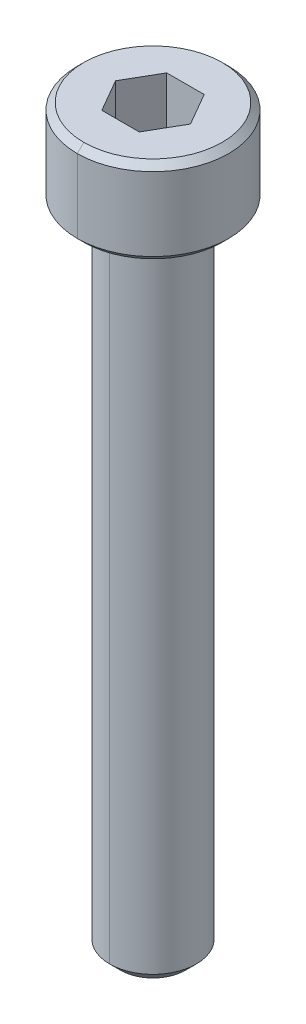
ISO-10303-21;
HEADER;
FILE_DESCRIPTION(('STEP AP214'),'2;1');
FILE_NAME('part.step','',(''),(''),'','','');
FILE_SCHEMA(('AUTOMOTIVE_DESIGN { 1 0 10303 214 1 1 1 1 }'));
ENDSEC;
DATA;
#1=APPLICATION_CONTEXT('core data for automotive mechanical design processes');
#2=APPLICATION_PROTOCOL_DEFINITION('international standard','automotive_design',2000,#1);
#3=PRODUCT_CONTEXT('',#1,'mechanical');
#4=PRODUCT('Part','Part','',(#3));
#5=PRODUCT_RELATED_PRODUCT_CATEGORY('part','',(#4));
#6=PRODUCT_DEFINITION_FORMATION('','',#4);
#7=PRODUCT_DEFINITION_CONTEXT('part definition',#1,'design');
#8=PRODUCT_DEFINITION('design','',#6,#7);
#9=PRODUCT_DEFINITION_SHAPE('','',#8);
#10=(LENGTH_UNIT() NAMED_UNIT(*) SI_UNIT(.MILLI.,.METRE.));
#11=(NAMED_UNIT(*) PLANE_ANGLE_UNIT() SI_UNIT($,.RADIAN.));
#12=(NAMED_UNIT(*) SI_UNIT($,.STERADIAN.) SOLID_ANGLE_UNIT());
#13=UNCERTAINTY_MEASURE_WITH_UNIT(LENGTH_MEASURE(1.E-05),#10,'distance_accuracy_value','');
#14=(GEOMETRIC_REPRESENTATION_CONTEXT(3) GLOBAL_UNCERTAINTY_ASSIGNED_CONTEXT((#13)) GLOBAL_UNIT_ASSIGNED_CONTEXT((#10,
#11,#12)) REPRESENTATION_CONTEXT('',''));
#15=CARTESIAN_POINT('',(0.,0.,0.));
#16=DIRECTION('',(0.,0.,1.));
#17=DIRECTION('',(1.,0.,0.));
#18=AXIS2_PLACEMENT_3D('',#15,#16,#17);
#19=CARTESIAN_POINT('',(0.866025403784439,31.,1.5));
#20=DIRECTION('',(0.866025403784439,0.,0.5));
#21=DIRECTION('',(0.5,0.,-0.866025403784439));
#22=AXIS2_PLACEMENT_3D('',#19,#20,#21);
#23=PLANE('',#22);
#24=DIRECTION('',(0.5,0.,-0.866025403784439));
#25=VECTOR('',#24,1.);
#26=CARTESIAN_POINT('',(0.866025403784439,31.,1.5));
#27=LINE('',#26,#25);
#28=CARTESIAN_POINT('',(0.866025403784439,31.,1.5));
#29=VERTEX_POINT('',#28);
#30=CARTESIAN_POINT('',(1.73205080756888,31.,0.));
#31=VERTEX_POINT('',#30);
#32=EDGE_CURVE('E179',#29,#31,#27,.T.);
#33=ORIENTED_EDGE('',*,*,#32,.F.);
#34=DIRECTION('',(0.,1.,0.));
#35=VECTOR('',#34,1.);
#36=CARTESIAN_POINT('',(0.866025403784439,31.,1.5));
#37=LINE('',#36,#35);
#38=CARTESIAN_POINT('',(0.866025403784439,34.,1.5));
#39=VERTEX_POINT('',#38);
#40=EDGE_CURVE('E167',#29,#39,#37,.T.);
#41=ORIENTED_EDGE('',*,*,#40,.T.);
#42=DIRECTION('',(0.5,0.,-0.866025403784439));
#43=VECTOR('',#42,1.);
#44=CARTESIAN_POINT('',(0.866025403784439,34.,1.5));
#45=LINE('',#44,#43);
#46=CARTESIAN_POINT('',(1.73205080756888,34.,0.));
#47=VERTEX_POINT('',#46);
#48=EDGE_CURVE('E181',#47,#39,#45,.F.);
#49=ORIENTED_EDGE('',*,*,#48,.F.);
#50=DIRECTION('',(0.,1.,0.));
#51=VECTOR('',#50,1.);
#52=CARTESIAN_POINT('',(1.73205080756888,31.,0.));
#53=LINE('',#52,#51);
#54=EDGE_CURVE('E174',#47,#31,#53,.F.);
#55=ORIENTED_EDGE('',*,*,#54,.T.);
#56=EDGE_LOOP('',(#33,#41,#49,#55));
#57=FACE_BOUND('',#56,.T.);
#58=ADVANCED_FACE('F17',(#57),#23,.F.);
#59=CARTESIAN_POINT('',(1.73205080756888,31.,0.));
#60=DIRECTION('',(0.866025403784438,0.,-0.5));
#61=DIRECTION('',(-0.5,0.,-0.866025403784438));
#62=AXIS2_PLACEMENT_3D('',#59,#60,#61);
#63=PLANE('',#62);
#64=DIRECTION('',(-0.5,0.,-0.866025403784438));
#65=VECTOR('',#64,1.);
#66=CARTESIAN_POINT('',(1.73205080756888,31.,0.));
#67=LINE('',#66,#65);
#68=CARTESIAN_POINT('',(0.866025403784438,31.,-1.5));
#69=VERTEX_POINT('',#68);
#70=EDGE_CURVE('E172',#31,#69,#67,.T.);
#71=ORIENTED_EDGE('',*,*,#70,.F.);
#72=ORIENTED_EDGE('',*,*,#54,.F.);
#73=DIRECTION('',(-0.5,0.,-0.866025403784438));
#74=VECTOR('',#73,1.);
#75=CARTESIAN_POINT('',(1.73205080756888,34.,0.));
#76=LINE('',#75,#74);
#77=CARTESIAN_POINT('',(0.866025403784439,34.,-1.5));
#78=VERTEX_POINT('',#77);
#79=EDGE_CURVE('E177',#78,#47,#76,.F.);
#80=ORIENTED_EDGE('',*,*,#79,.F.);
#81=DIRECTION('',(0.,1.,0.));
#82=VECTOR('',#81,1.);
#83=CARTESIAN_POINT('',(0.866025403784438,31.,-1.5));
#84=LINE('',#83,#82);
#85=EDGE_CURVE('E162',#78,#69,#84,.F.);
#86=ORIENTED_EDGE('',*,*,#85,.T.);
#87=EDGE_LOOP('',(#71,#72,#80,#86));
#88=FACE_BOUND('',#87,.T.);
#89=ADVANCED_FACE('F417',(#88),#63,.F.);
#90=CARTESIAN_POINT('',(-0.866025403784438,31.,1.5));
#91=DIRECTION('',(0.,0.,1.));
#92=DIRECTION('',(1.,0.,0.));
#93=AXIS2_PLACEMENT_3D('',#90,#91,#92);
#94=PLANE('',#93);
#95=DIRECTION('',(1.,0.,0.));
#96=VECTOR('',#95,1.);
#97=CARTESIAN_POINT('',(1.73205080756888,31.,1.5));
#98=LINE('',#97,#96);
#99=CARTESIAN_POINT('',(-0.866025403784438,31.,1.5));
#100=VERTEX_POINT('',#99);
#101=EDGE_CURVE('E159',#100,#29,#98,.T.);
#102=ORIENTED_EDGE('',*,*,#101,.F.);
#103=DIRECTION('',(0.,1.,0.));
#104=VECTOR('',#103,1.);
#105=CARTESIAN_POINT('',(-0.866025403784438,31.,1.5));
#106=LINE('',#105,#104);
#107=CARTESIAN_POINT('',(-0.866025403784438,34.,1.5));
#108=VERTEX_POINT('',#107);
#109=EDGE_CURVE('E148',#100,#108,#106,.T.);
#110=ORIENTED_EDGE('',*,*,#109,.T.);
#111=DIRECTION('',(1.,0.,0.));
#112=VECTOR('',#111,1.);
#113=CARTESIAN_POINT('',(-0.866025403784438,34.,1.5));
#114=LINE('',#113,#112);
#115=EDGE_CURVE('E170',#39,#108,#114,.F.);
#116=ORIENTED_EDGE('',*,*,#115,.F.);
#117=ORIENTED_EDGE('',*,*,#40,.F.);
#118=EDGE_LOOP('',(#102,#110,#116,#117));
#119=FACE_BOUND('',#118,.T.);
#120=ADVANCED_FACE('F408',(#119),#94,.F.);
#121=CARTESIAN_POINT('',(0.866025403784438,31.,-1.5));
#122=DIRECTION('',(0.,0.,-1.));
#123=DIRECTION('',(-1.,0.,0.));
#124=AXIS2_PLACEMENT_3D('',#121,#122,#123);
#125=PLANE('',#124);
#126=DIRECTION('',(1.,0.,0.));
#127=VECTOR('',#126,1.);
#128=CARTESIAN_POINT('',(1.73205080756888,31.,-1.5));
#129=LINE('',#128,#127);
#130=CARTESIAN_POINT('',(-0.866025403784438,31.,-1.5));
#131=VERTEX_POINT('',#130);
#132=EDGE_CURVE('E156',#69,#131,#129,.F.);
#133=ORIENTED_EDGE('',*,*,#132,.F.);
#134=ORIENTED_EDGE('',*,*,#85,.F.);
#135=DIRECTION('',(-1.,0.,0.));
#136=VECTOR('',#135,1.);
#137=CARTESIAN_POINT('',(0.866025403784438,34.,-1.5));
#138=LINE('',#137,#136);
#139=CARTESIAN_POINT('',(-0.866025403784438,34.,-1.5));
#140=VERTEX_POINT('',#139);
#141=EDGE_CURVE('E165',#140,#78,#138,.F.);
#142=ORIENTED_EDGE('',*,*,#141,.F.);
#143=DIRECTION('',(0.,1.,0.));
#144=VECTOR('',#143,1.);
#145=CARTESIAN_POINT('',(-0.866025403784438,31.,-1.5));
#146=LINE('',#145,#144);
#147=EDGE_CURVE('E146',#140,#131,#146,.F.);
#148=ORIENTED_EDGE('',*,*,#147,.T.);
#149=EDGE_LOOP('',(#133,#134,#142,#148));
#150=FACE_BOUND('',#149,.T.);
#151=ADVANCED_FACE('F399',(#150),#125,.F.);
#152=CARTESIAN_POINT('',(1.73205080756888,31.,0.));
#153=DIRECTION('',(0.,1.,0.));
#154=DIRECTION('',(0.,0.,1.));
#155=AXIS2_PLACEMENT_3D('',#152,#153,#154);
#156=PLANE('',#155);
#157=ORIENTED_EDGE('',*,*,#132,.T.);
#158=DIRECTION('',(-0.5,0.,0.866025403784439));
#159=VECTOR('',#158,1.);
#160=CARTESIAN_POINT('',(-0.866025403784438,31.,-1.5));
#161=LINE('',#160,#159);
#162=CARTESIAN_POINT('',(-1.73205080756888,31.,0.));
#163=VERTEX_POINT('',#162);
#164=EDGE_CURVE('E144',#131,#163,#161,.T.);
#165=ORIENTED_EDGE('',*,*,#164,.T.);
#166=DIRECTION('',(0.5,0.,0.866025403784439));
#167=VECTOR('',#166,1.);
#168=CARTESIAN_POINT('',(-1.73205080756888,31.,0.));
#169=LINE('',#168,#167);
#170=EDGE_CURVE('E151',#163,#100,#169,.T.);
#171=ORIENTED_EDGE('',*,*,#170,.T.);
#172=ORIENTED_EDGE('',*,*,#101,.T.);
#173=ORIENTED_EDGE('',*,*,#32,.T.);
#174=ORIENTED_EDGE('',*,*,#70,.T.);
#175=EDGE_LOOP('',(#157,#165,#171,#172,#173,#174));
#176=FACE_BOUND('',#175,.T.);
#177=ADVANCED_FACE('F390',(#176),#156,.T.);
#178=CARTESIAN_POINT('',(-1.73205080756888,31.,0.));
#179=DIRECTION('',(-0.866025403784439,0.,0.5));
#180=DIRECTION('',(0.5,0.,0.866025403784439));
#181=AXIS2_PLACEMENT_3D('',#178,#179,#180);
#182=PLANE('',#181);
#183=ORIENTED_EDGE('',*,*,#170,.F.);
#184=DIRECTION('',(0.,1.,0.));
#185=VECTOR('',#184,1.);
#186=CARTESIAN_POINT('',(-1.73205080756888,31.,0.));
#187=LINE('',#186,#185);
#188=CARTESIAN_POINT('',(-1.73205080756888,34.,0.));
#189=VERTEX_POINT('',#188);
#190=EDGE_CURVE('E141',#163,#189,#187,.T.);
#191=ORIENTED_EDGE('',*,*,#190,.T.);
#192=DIRECTION('',(0.5,0.,0.866025403784439));
#193=VECTOR('',#192,1.);
#194=CARTESIAN_POINT('',(-1.73205080756888,34.,0.));
#195=LINE('',#194,#193);
#196=EDGE_CURVE('E154',#108,#189,#195,.F.);
#197=ORIENTED_EDGE('',*,*,#196,.F.);
#198=ORIENTED_EDGE('',*,*,#109,.F.);
#199=EDGE_LOOP('',(#183,#191,#197,#198));
#200=FACE_BOUND('',#199,.T.);
#201=ADVANCED_FACE('F381',(#200),#182,.F.);
#202=CARTESIAN_POINT('',(-0.866025403784438,31.,-1.5));
#203=DIRECTION('',(-0.866025403784439,0.,-0.5));
#204=DIRECTION('',(-0.5,0.,0.866025403784439));
#205=AXIS2_PLACEMENT_3D('',#202,#203,#204);
#206=PLANE('',#205);
#207=ORIENTED_EDGE('',*,*,#164,.F.);
#208=ORIENTED_EDGE('',*,*,#147,.F.);
#209=DIRECTION('',(0.5,0.,-0.866025403784439));
#210=VECTOR('',#209,1.);
#211=CARTESIAN_POINT('',(-1.73205080756888,34.,0.));
#212=LINE('',#211,#210);
#213=EDGE_CURVE('E122',#189,#140,#212,.T.);
#214=ORIENTED_EDGE('',*,*,#213,.F.);
#215=ORIENTED_EDGE('',*,*,#190,.F.);
#216=EDGE_LOOP('',(#207,#208,#214,#215));
#217=FACE_BOUND('',#216,.T.);
#218=ADVANCED_FACE('F373',(#217),#206,.F.);
#219=CARTESIAN_POINT('',(0.,34.,-3.5));
#220=DIRECTION('',(0.,1.,0.));
#221=DIRECTION('',(0.,0.,1.));
#222=AXIS2_PLACEMENT_3D('',#219,#220,#221);
#223=PLANE('',#222);
#224=CARTESIAN_POINT('',(0.,34.0000000000487,0.));
#225=DIRECTION('',(0.,-1.,0.));
#226=DIRECTION('',(0.,0.,-1.));
#227=AXIS2_PLACEMENT_3D('',#224,#225,#226);
#228=CIRCLE('',#227,3.19999999999254);
#229=CARTESIAN_POINT('',(0.,34.0000000000487,-3.19999999999254));
#230=VERTEX_POINT('',#229);
#231=CARTESIAN_POINT('',(0.,34.0000000000487,3.19999999999254));
#232=VERTEX_POINT('',#231);
#233=EDGE_CURVE('E111',#230,#232,#228,.T.);
#234=ORIENTED_EDGE('',*,*,#233,.F.);
#235=CARTESIAN_POINT('',(0.,34.0000000000487,0.));
#236=DIRECTION('',(0.,-1.,0.));
#237=DIRECTION('',(0.,0.,-1.));
#238=AXIS2_PLACEMENT_3D('',#235,#236,#237);
#239=CIRCLE('',#238,3.19999999999254);
#240=EDGE_CURVE('E20',#232,#230,#239,.T.);
#241=ORIENTED_EDGE('',*,*,#240,.F.);
#242=EDGE_LOOP('',(#234,#241));
#243=FACE_BOUND('',#242,.T.);
#244=ORIENTED_EDGE('',*,*,#196,.T.);
#245=ORIENTED_EDGE('',*,*,#213,.T.);
#246=ORIENTED_EDGE('',*,*,#141,.T.);
#247=ORIENTED_EDGE('',*,*,#79,.T.);
#248=ORIENTED_EDGE('',*,*,#48,.T.);
#249=ORIENTED_EDGE('',*,*,#115,.T.);
#250=EDGE_LOOP('',(#244,#245,#246,#247,#248,#249));
#251=FACE_BOUND('',#250,.T.);
#252=ADVANCED_FACE('F112',(#243,#251),#223,.T.);
#253=CARTESIAN_POINT('',(0.,33.7000000000671,0.));
#254=DIRECTION('',(0.,-1.,0.));
#255=DIRECTION('',(0.,0.,-1.));
#256=AXIS2_PLACEMENT_3D('',#253,#254,#255);
#257=CONICAL_SURFACE('',#256,3.49999999997408,0.785398163397448);
#258=DIRECTION('',(0.,0.707106781186548,0.707106781186548));
#259=VECTOR('',#258,1.);
#260=CARTESIAN_POINT('',(0.,-498962.8,-499000.));
#261=LINE('',#260,#259);
#262=CARTESIAN_POINT('',(0.,33.7000000000168,-3.49999999999352));
#263=VERTEX_POINT('',#262);
#264=EDGE_CURVE('E120',#263,#230,#261,.T.);
#265=ORIENTED_EDGE('',*,*,#264,.F.);
#266=CARTESIAN_POINT('',(0.,33.7,0.));
#267=DIRECTION('',(0.,-1.,0.));
#268=DIRECTION('',(0.,0.,-1.));
#269=AXIS2_PLACEMENT_3D('',#266,#267,#268);
#270=CIRCLE('',#269,3.5);
#271=CARTESIAN_POINT('',(0.,33.7000000000168,3.49999999999352));
#272=VERTEX_POINT('',#271);
#273=EDGE_CURVE('E127',#272,#263,#270,.T.);
#274=ORIENTED_EDGE('',*,*,#273,.F.);
#275=DIRECTION('',(0.,0.707106781186548,-0.707106781186548));
#276=VECTOR('',#275,1.);
#277=CARTESIAN_POINT('',(6.11098752774529E-11,-498962.8,499000.));
#278=LINE('',#277,#276);
#279=EDGE_CURVE('E117',#232,#272,#278,.F.);
#280=ORIENTED_EDGE('',*,*,#279,.F.);
#281=ORIENTED_EDGE('',*,*,#240,.T.);
#282=EDGE_LOOP('',(#265,#274,#280,#281));
#283=FACE_BOUND('',#282,.T.);
#284=ADVANCED_FACE('F119',(#283),#257,.T.);
#285=CARTESIAN_POINT('',(0.,33.7000000000671,0.));
#286=DIRECTION('',(0.,-1.,0.));
#287=DIRECTION('',(0.,0.,-1.));
#288=AXIS2_PLACEMENT_3D('',#285,#286,#287);
#289=CONICAL_SURFACE('',#288,3.49999999997408,0.785398163397448);
#290=CARTESIAN_POINT('',(0.,33.7,0.));
#291=DIRECTION('',(0.,-1.,0.));
#292=DIRECTION('',(0.,0.,-1.));
#293=AXIS2_PLACEMENT_3D('',#290,#291,#292);
#294=CIRCLE('',#293,3.5);
#295=EDGE_CURVE('E125',#263,#272,#294,.T.);
#296=ORIENTED_EDGE('',*,*,#295,.F.);
#297=ORIENTED_EDGE('',*,*,#264,.T.);
#298=ORIENTED_EDGE('',*,*,#233,.T.);
#299=ORIENTED_EDGE('',*,*,#279,.T.);
#300=EDGE_LOOP('',(#296,#297,#298,#299));
#301=FACE_BOUND('',#300,.T.);
#302=ADVANCED_FACE('F123',(#301),#289,.T.);
#303=CARTESIAN_POINT('',(0.,0.,0.));
#304=DIRECTION('',(0.,-1.,0.));
#305=DIRECTION('',(0.,0.,-1.));
#306=AXIS2_PLACEMENT_3D('',#303,#304,#305);
#307=CYLINDRICAL_SURFACE('',#306,3.5);
#308=DIRECTION('',(0.,-1.,0.));
#309=VECTOR('',#308,1.);
#310=CARTESIAN_POINT('',(0.,0.,-3.5));
#311=LINE('',#310,#309);
#312=CARTESIAN_POINT('',(0.,30.3000000000466,-3.50000000000898));
#313=VERTEX_POINT('',#312);
#314=EDGE_CURVE('E226',#313,#263,#311,.F.);
#315=ORIENTED_EDGE('',*,*,#314,.F.);
#316=CARTESIAN_POINT('',(0.,30.3000000000679,0.));
#317=DIRECTION('',(0.,1.,0.));
#318=DIRECTION('',(0.,0.,1.));
#319=AXIS2_PLACEMENT_3D('',#316,#317,#318);
#320=CIRCLE('',#319,3.50000000003092);
#321=CARTESIAN_POINT('',(0.,30.3000000000537,3.50000000000898));
#322=VERTEX_POINT('',#321);
#323=EDGE_CURVE('E221',#322,#313,#320,.F.);
#324=ORIENTED_EDGE('',*,*,#323,.F.);
#325=DIRECTION('',(0.,-1.,0.));
#326=VECTOR('',#325,1.);
#327=CARTESIAN_POINT('',(0.,0.,3.5));
#328=LINE('',#327,#326);
#329=EDGE_CURVE('E231',#272,#322,#328,.T.);
#330=ORIENTED_EDGE('',*,*,#329,.F.);
#331=ORIENTED_EDGE('',*,*,#273,.T.);
#332=EDGE_LOOP('',(#315,#324,#330,#331));
#333=FACE_BOUND('',#332,.T.);
#334=ADVANCED_FACE('F246',(#333),#307,.T.);
#335=CARTESIAN_POINT('',(0.,0.,0.));
#336=DIRECTION('',(0.,-1.,0.));
#337=DIRECTION('',(0.,0.,-1.));
#338=AXIS2_PLACEMENT_3D('',#335,#336,#337);
#339=CYLINDRICAL_SURFACE('',#338,3.5);
#340=CARTESIAN_POINT('',(0.,30.3000000000679,0.));
#341=DIRECTION('',(0.,1.,0.));
#342=DIRECTION('',(0.,0.,1.));
#343=AXIS2_PLACEMENT_3D('',#340,#341,#342);
#344=CIRCLE('',#343,3.50000000003092);
#345=EDGE_CURVE('E206',#313,#322,#344,.F.);
#346=ORIENTED_EDGE('',*,*,#345,.F.);
#347=ORIENTED_EDGE('',*,*,#314,.T.);
#348=ORIENTED_EDGE('',*,*,#295,.T.);
#349=ORIENTED_EDGE('',*,*,#329,.T.);
#350=EDGE_LOOP('',(#346,#347,#348,#349));
#351=FACE_BOUND('',#350,.T.);
#352=ADVANCED_FACE('F243',(#351),#339,.T.);
#353=CARTESIAN_POINT('',(0.,30.3000000000111,0.));
#354=DIRECTION('',(0.,1.,0.));
#355=DIRECTION('',(0.,0.,1.));
#356=AXIS2_PLACEMENT_3D('',#353,#354,#355);
#357=CONICAL_SURFACE('',#356,3.49999999997408,0.785398163397448);
#358=DIRECTION('',(0.,-0.707106781186548,-0.707106781186548));
#359=VECTOR('',#358,1.);
#360=CARTESIAN_POINT('',(0.,499000.,498973.2));
#361=LINE('',#360,#359);
#362=CARTESIAN_POINT('',(0.,30.0000000000296,3.19999999999254));
#363=VERTEX_POINT('',#362);
#364=EDGE_CURVE('E203',#322,#363,#361,.T.);
#365=ORIENTED_EDGE('',*,*,#364,.F.);
#366=ORIENTED_EDGE('',*,*,#323,.T.);
#367=DIRECTION('',(0.,-0.707106781186548,0.707106781186548));
#368=VECTOR('',#367,1.);
#369=CARTESIAN_POINT('',(6.11065932240312E-11,499000.,-498973.2));
#370=LINE('',#369,#368);
#371=CARTESIAN_POINT('',(0.,30.0000000000296,-3.19999999999254));
#372=VERTEX_POINT('',#371);
#373=EDGE_CURVE('E212',#372,#313,#370,.F.);
#374=ORIENTED_EDGE('',*,*,#373,.F.);
#375=CARTESIAN_POINT('',(0.,30.0000000000296,0.));
#376=DIRECTION('',(0.,1.,0.));
#377=DIRECTION('',(0.,0.,1.));
#378=AXIS2_PLACEMENT_3D('',#375,#376,#377);
#379=CIRCLE('',#378,3.19999999999254);
#380=EDGE_CURVE('E198',#363,#372,#379,.F.);
#381=ORIENTED_EDGE('',*,*,#380,.F.);
#382=EDGE_LOOP('',(#365,#366,#374,#381));
#383=FACE_BOUND('',#382,.T.);
#384=ADVANCED_FACE('F248',(#383),#357,.T.);
#385=CARTESIAN_POINT('',(0.,30.3000000000111,0.));
#386=DIRECTION('',(0.,1.,0.));
#387=DIRECTION('',(0.,0.,1.));
#388=AXIS2_PLACEMENT_3D('',#385,#386,#387);
#389=CONICAL_SURFACE('',#388,3.49999999997408,0.785398163397448);
#390=ORIENTED_EDGE('',*,*,#345,.T.);
#391=ORIENTED_EDGE('',*,*,#364,.T.);
#392=CARTESIAN_POINT('',(0.,30.0000000000296,0.));
#393=DIRECTION('',(0.,1.,0.));
#394=DIRECTION('',(0.,0.,1.));
#395=AXIS2_PLACEMENT_3D('',#392,#393,#394);
#396=CIRCLE('',#395,3.19999999999254);
#397=EDGE_CURVE('E195',#372,#363,#396,.F.);
#398=ORIENTED_EDGE('',*,*,#397,.F.);
#399=ORIENTED_EDGE('',*,*,#373,.T.);
#400=EDGE_LOOP('',(#390,#391,#398,#399));
#401=FACE_BOUND('',#400,.T.);
#402=ADVANCED_FACE('F249',(#401),#389,.T.);
#403=CARTESIAN_POINT('',(0.,0.,0.));
#404=DIRECTION('',(0.,-1.,0.));
#405=DIRECTION('',(0.,0.,-1.));
#406=AXIS2_PLACEMENT_3D('',#403,#404,#405);
#407=PLANE('',#406);
#408=CARTESIAN_POINT('',(0.,1.13686837721616E-10,0.));
#409=DIRECTION('',(0.,1.,0.));
#410=DIRECTION('',(0.,0.,1.));
#411=AXIS2_PLACEMENT_3D('',#408,#409,#410);
#412=CIRCLE('',#411,1.50000000002137);
#413=CARTESIAN_POINT('',(0.,1.13686837721616E-10,1.50000000002137));
#414=VERTEX_POINT('',#413);
#415=CARTESIAN_POINT('',(0.,1.13686837721616E-10,-1.50000000002137));
#416=VERTEX_POINT('',#415);
#417=EDGE_CURVE('E191',#414,#416,#412,.T.);
#418=ORIENTED_EDGE('',*,*,#417,.F.);
#419=CARTESIAN_POINT('',(0.,1.13686837721616E-10,0.));
#420=DIRECTION('',(0.,1.,0.));
#421=DIRECTION('',(0.,0.,1.));
#422=AXIS2_PLACEMENT_3D('',#419,#420,#421);
#423=CIRCLE('',#422,1.50000000002137);
#424=EDGE_CURVE('E201',#416,#414,#423,.T.);
#425=ORIENTED_EDGE('',*,*,#424,.F.);
#426=EDGE_LOOP('',(#418,#425));
#427=FACE_BOUND('',#426,.T.);
#428=ADVANCED_FACE('F271',(#427),#407,.T.);
#429=CARTESIAN_POINT('',(0.,0.50000000004502,0.));
#430=DIRECTION('',(0.,1.,0.));
#431=DIRECTION('',(0.,0.,1.));
#432=AXIS2_PLACEMENT_3D('',#429,#430,#431);
#433=CONICAL_SURFACE('',#432,1.99999999995271,0.785398163397448);
#434=DIRECTION('',(0.,-0.707106781186548,-0.707106781186547));
#435=VECTOR('',#434,1.);
#436=CARTESIAN_POINT('',(0.,498998.5,499000.));
#437=LINE('',#436,#435);
#438=CARTESIAN_POINT('',(0.,0.50000000002814,1.99999999997044));
#439=VERTEX_POINT('',#438);
#440=EDGE_CURVE('E190',#439,#414,#437,.T.);
#441=ORIENTED_EDGE('',*,*,#440,.F.);
#442=CARTESIAN_POINT('',(0.,0.500000000000006,0.));
#443=DIRECTION('',(0.,-1.,0.));
#444=DIRECTION('',(0.,0.,-1.));
#445=AXIS2_PLACEMENT_3D('',#442,#443,#444);
#446=CIRCLE('',#445,2.);
#447=CARTESIAN_POINT('',(0.,0.500000000033766,-1.99999999996453));
#448=VERTEX_POINT('',#447);
#449=EDGE_CURVE('E35',#448,#439,#446,.F.);
#450=ORIENTED_EDGE('',*,*,#449,.F.);
#451=DIRECTION('',(0.,-0.707106781186548,0.707106781186547));
#452=VECTOR('',#451,1.);
#453=CARTESIAN_POINT('',(6.11098752774529E-11,498998.5,-499000.));
#454=LINE('',#453,#452);
#455=EDGE_CURVE('E194',#416,#448,#454,.F.);
#456=ORIENTED_EDGE('',*,*,#455,.F.);
#457=ORIENTED_EDGE('',*,*,#424,.T.);
#458=EDGE_LOOP('',(#441,#450,#456,#457));
#459=FACE_BOUND('',#458,.T.);
#460=ADVANCED_FACE('F255',(#459),#433,.T.);
#461=CARTESIAN_POINT('',(0.,30.,-2.));
#462=DIRECTION('',(0.,-1.,0.));
#463=DIRECTION('',(0.,0.,-1.));
#464=AXIS2_PLACEMENT_3D('',#461,#462,#463);
#465=PLANE('',#464);
#466=ORIENTED_EDGE('',*,*,#380,.T.);
#467=ORIENTED_EDGE('',*,*,#397,.T.);
#468=EDGE_LOOP('',(#466,#467));
#469=FACE_BOUND('',#468,.T.);
#470=CARTESIAN_POINT('',(0.,30.,0.));
#471=DIRECTION('',(0.,-1.,0.));
#472=DIRECTION('',(0.,0.,-1.));
#473=AXIS2_PLACEMENT_3D('',#470,#471,#472);
#474=CIRCLE('',#473,2.);
#475=CARTESIAN_POINT('',(0.,30.,-2.));
#476=VERTEX_POINT('',#475);
#477=CARTESIAN_POINT('',(0.,30.,2.));
#478=VERTEX_POINT('',#477);
#479=EDGE_CURVE('E183',#476,#478,#474,.T.);
#480=ORIENTED_EDGE('',*,*,#479,.F.);
#481=CARTESIAN_POINT('',(0.,30.,0.));
#482=DIRECTION('',(0.,-1.,0.));
#483=DIRECTION('',(0.,0.,-1.));
#484=AXIS2_PLACEMENT_3D('',#481,#482,#483);
#485=CIRCLE('',#484,2.);
#486=EDGE_CURVE('E187',#478,#476,#485,.T.);
#487=ORIENTED_EDGE('',*,*,#486,.F.);
#488=EDGE_LOOP('',(#480,#487));
#489=FACE_BOUND('',#488,.T.);
#490=ADVANCED_FACE('F251',(#469,#489),#465,.T.);
#491=CARTESIAN_POINT('',(0.,0.50000000004502,0.));
#492=DIRECTION('',(0.,1.,0.));
#493=DIRECTION('',(0.,0.,1.));
#494=AXIS2_PLACEMENT_3D('',#491,#492,#493);
#495=CONICAL_SURFACE('',#494,1.99999999995271,0.785398163397448);
#496=CARTESIAN_POINT('',(0.,0.500000000000006,0.));
#497=DIRECTION('',(0.,-1.,0.));
#498=DIRECTION('',(0.,0.,-1.));
#499=AXIS2_PLACEMENT_3D('',#496,#497,#498);
#500=CIRCLE('',#499,2.);
#501=EDGE_CURVE('E26',#439,#448,#500,.F.);
#502=ORIENTED_EDGE('',*,*,#501,.F.);
#503=ORIENTED_EDGE('',*,*,#440,.T.);
#504=ORIENTED_EDGE('',*,*,#417,.T.);
#505=ORIENTED_EDGE('',*,*,#455,.T.);
#506=EDGE_LOOP('',(#502,#503,#504,#505));
#507=FACE_BOUND('',#506,.T.);
#508=ADVANCED_FACE('F254',(#507),#495,.T.);
#509=CARTESIAN_POINT('',(0.,0.,0.));
#510=DIRECTION('',(0.,-1.,0.));
#511=DIRECTION('',(0.,0.,-1.));
#512=AXIS2_PLACEMENT_3D('',#509,#510,#511);
#513=CYLINDRICAL_SURFACE('',#512,2.);
#514=DIRECTION('',(0.,-1.,0.));
#515=VECTOR('',#514,1.);
#516=CARTESIAN_POINT('',(0.,0.,-2.));
#517=LINE('',#516,#515);
#518=EDGE_CURVE('E11',#448,#476,#517,.F.);
#519=ORIENTED_EDGE('',*,*,#518,.F.);
#520=ORIENTED_EDGE('',*,*,#449,.T.);
#521=DIRECTION('',(0.,-1.,0.));
#522=VECTOR('',#521,1.);
#523=CARTESIAN_POINT('',(0.,0.,2.));
#524=LINE('',#523,#522);
#525=EDGE_CURVE('E186',#478,#439,#524,.T.);
#526=ORIENTED_EDGE('',*,*,#525,.F.);
#527=ORIENTED_EDGE('',*,*,#486,.T.);
#528=EDGE_LOOP('',(#519,#520,#526,#527));
#529=FACE_BOUND('',#528,.T.);
#530=ADVANCED_FACE('F262',(#529),#513,.T.);
#531=CARTESIAN_POINT('',(0.,0.,0.));
#532=DIRECTION('',(0.,-1.,0.));
#533=DIRECTION('',(0.,0.,-1.));
#534=AXIS2_PLACEMENT_3D('',#531,#532,#533);
#535=CYLINDRICAL_SURFACE('',#534,2.);
#536=ORIENTED_EDGE('',*,*,#501,.T.);
#537=ORIENTED_EDGE('',*,*,#518,.T.);
#538=ORIENTED_EDGE('',*,*,#479,.T.);
#539=ORIENTED_EDGE('',*,*,#525,.T.);
#540=EDGE_LOOP('',(#536,#537,#538,#539));
#541=FACE_BOUND('',#540,.T.);
#542=ADVANCED_FACE('F264',(#541),#535,.T.);
#543=CLOSED_SHELL('',(#58,#89,#120,#151,#177,#201,#218,#252,#284,#302,#334,#352,#384,#402,#428,
#460,#490,#508,#530,#542));
#544=MANIFOLD_SOLID_BREP('B1',#543);
#545=ADVANCED_BREP_SHAPE_REPRESENTATION('',(#18,#544),#14);
#546=SHAPE_DEFINITION_REPRESENTATION(#9,#545);
ENDSEC;
END-ISO-10303-21;
